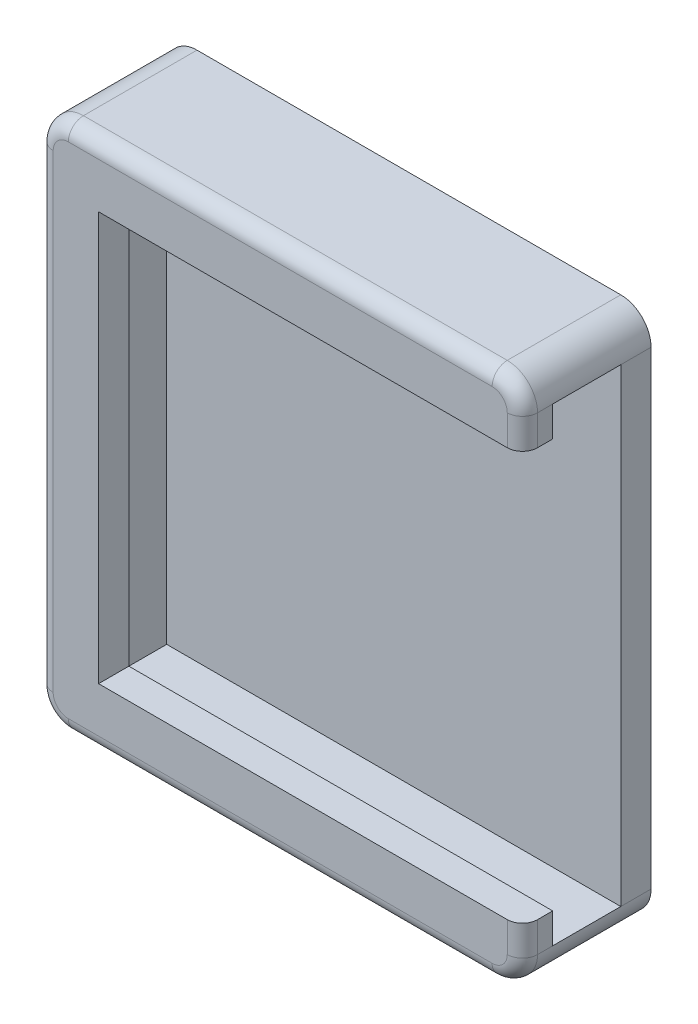
ISO-10303-21;
HEADER;
FILE_DESCRIPTION(('STEP AP214'),'2;1');
FILE_NAME('part.step','',(''),(''),'','','');
FILE_SCHEMA(('AUTOMOTIVE_DESIGN { 1 0 10303 214 1 1 1 1 }'));
ENDSEC;
DATA;
#1=APPLICATION_CONTEXT('core data for automotive mechanical design processes');
#2=APPLICATION_PROTOCOL_DEFINITION('international standard','automotive_design',2000,#1);
#3=PRODUCT_CONTEXT('',#1,'mechanical');
#4=PRODUCT('Part','Part','',(#3));
#5=PRODUCT_RELATED_PRODUCT_CATEGORY('part','',(#4));
#6=PRODUCT_DEFINITION_FORMATION('','',#4);
#7=PRODUCT_DEFINITION_CONTEXT('part definition',#1,'design');
#8=PRODUCT_DEFINITION('design','',#6,#7);
#9=PRODUCT_DEFINITION_SHAPE('','',#8);
#10=(LENGTH_UNIT() NAMED_UNIT(*) SI_UNIT(.MILLI.,.METRE.));
#11=(NAMED_UNIT(*) PLANE_ANGLE_UNIT() SI_UNIT($,.RADIAN.));
#12=(NAMED_UNIT(*) SI_UNIT($,.STERADIAN.) SOLID_ANGLE_UNIT());
#13=UNCERTAINTY_MEASURE_WITH_UNIT(LENGTH_MEASURE(1.E-05),#10,'distance_accuracy_value','');
#14=(GEOMETRIC_REPRESENTATION_CONTEXT(3) GLOBAL_UNCERTAINTY_ASSIGNED_CONTEXT((#13)) GLOBAL_UNIT_ASSIGNED_CONTEXT((#10,
#11,#12)) REPRESENTATION_CONTEXT('',''));
#15=CARTESIAN_POINT('',(0.,0.,0.));
#16=DIRECTION('',(0.,0.,1.));
#17=DIRECTION('',(1.,0.,0.));
#18=AXIS2_PLACEMENT_3D('',#15,#16,#17);
#19=CARTESIAN_POINT('',(-157.423957436964,7.33161186550156,2.));
#20=DIRECTION('',(-1.,0.,0.));
#21=DIRECTION('',(0.,0.,1.));
#22=AXIS2_PLACEMENT_3D('',#19,#20,#21);
#23=PLANE('',#22);
#24=DIRECTION('',(0.,1.,0.));
#25=VECTOR('',#24,1.);
#26=CARTESIAN_POINT('',(-157.423957436964,7.33161186550156,0.));
#27=LINE('',#26,#25);
#28=CARTESIAN_POINT('',(-157.423957436964,9.33161186550156,0.));
#29=VERTEX_POINT('',#28);
#30=CARTESIAN_POINT('',(-157.423957436964,40.3316118655016,0.));
#31=VERTEX_POINT('',#30);
#32=EDGE_CURVE('E265',#29,#31,#27,.T.);
#33=ORIENTED_EDGE('',*,*,#32,.T.);
#34=DIRECTION('',(0.,0.,-1.));
#35=VECTOR('',#34,1.);
#36=CARTESIAN_POINT('',(-157.423957436964,40.3316118655016,2.));
#37=LINE('',#36,#35);
#38=CARTESIAN_POINT('',(-157.423957436964,40.3316118655016,2.));
#39=VERTEX_POINT('',#38);
#40=EDGE_CURVE('E289',#31,#39,#37,.F.);
#41=ORIENTED_EDGE('',*,*,#40,.T.);
#42=DIRECTION('',(0.,1.,0.));
#43=VECTOR('',#42,1.);
#44=CARTESIAN_POINT('',(-157.423957436964,7.33161186550156,2.));
#45=LINE('',#44,#43);
#46=CARTESIAN_POINT('',(-157.423957436964,9.33161186550156,2.));
#47=VERTEX_POINT('',#46);
#48=EDGE_CURVE('E255',#47,#39,#45,.T.);
#49=ORIENTED_EDGE('',*,*,#48,.F.);
#50=DIRECTION('',(0.,0.,-1.));
#51=VECTOR('',#50,1.);
#52=CARTESIAN_POINT('',(-157.423957436964,9.33161186550156,2.));
#53=LINE('',#52,#51);
#54=EDGE_CURVE('E282',#47,#29,#53,.T.);
#55=ORIENTED_EDGE('',*,*,#54,.T.);
#56=EDGE_LOOP('',(#33,#41,#49,#55));
#57=FACE_BOUND('',#56,.T.);
#58=ADVANCED_FACE('F35',(#57),#23,.F.);
#59=DIRECTION('',(0.,0.,-1.));
#60=VECTOR('',#59,1.);
#61=CARTESIAN_POINT('',(-157.423957436964,11.3316118655016,8.5));
#62=LINE('',#61,#60);
#63=CARTESIAN_POINT('',(-157.423957436964,11.3316118655016,7.5));
#64=VERTEX_POINT('',#63);
#65=CARTESIAN_POINT('',(-157.423957436964,11.3316118655016,6.5));
#66=VERTEX_POINT('',#65);
#67=EDGE_CURVE('E199',#64,#66,#62,.T.);
#68=ORIENTED_EDGE('',*,*,#67,.F.);
#69=DIRECTION('',(0.,1.,0.));
#70=VECTOR('',#69,1.);
#71=CARTESIAN_POINT('',(-157.423957436964,7.33161186550156,7.5));
#72=LINE('',#71,#70);
#73=CARTESIAN_POINT('',(-157.423957436964,9.33161186550156,7.5));
#74=VERTEX_POINT('',#73);
#75=EDGE_CURVE('E329',#64,#74,#72,.F.);
#76=ORIENTED_EDGE('',*,*,#75,.T.);
#77=DIRECTION('',(0.,0.,-1.));
#78=VECTOR('',#77,1.);
#79=CARTESIAN_POINT('',(-157.423957436964,9.33161186550156,2.));
#80=LINE('',#79,#78);
#81=CARTESIAN_POINT('',(-157.423957436964,9.33161186550156,6.5));
#82=VERTEX_POINT('',#81);
#83=EDGE_CURVE('E284',#74,#82,#80,.T.);
#84=ORIENTED_EDGE('',*,*,#83,.T.);
#85=DIRECTION('',(0.,1.,0.));
#86=VECTOR('',#85,1.);
#87=CARTESIAN_POINT('',(-157.423957436964,7.33161186550156,6.5));
#88=LINE('',#87,#86);
#89=EDGE_CURVE('E213',#82,#66,#88,.T.);
#90=ORIENTED_EDGE('',*,*,#89,.T.);
#91=EDGE_LOOP('',(#68,#76,#84,#90));
#92=FACE_BOUND('',#91,.T.);
#93=ADVANCED_FACE('F366',(#92),#23,.F.);
#94=CARTESIAN_POINT('',(0.,0.,2.));
#95=DIRECTION('',(0.,0.,-1.));
#96=DIRECTION('',(-1.,0.,0.));
#97=AXIS2_PLACEMENT_3D('',#94,#95,#96);
#98=PLANE('',#97);
#99=DIRECTION('',(1.,0.,0.));
#100=VECTOR('',#99,1.);
#101=CARTESIAN_POINT('',(-157.423957436964,40.3316118655016,2.));
#102=LINE('',#101,#100);
#103=CARTESIAN_POINT('',(-187.423957436964,40.3316118655016,2.));
#104=VERTEX_POINT('',#103);
#105=EDGE_CURVE('E238',#104,#39,#102,.T.);
#106=ORIENTED_EDGE('',*,*,#105,.F.);
#107=DIRECTION('',(0.,1.,0.));
#108=VECTOR('',#107,1.);
#109=CARTESIAN_POINT('',(-187.423957436964,40.3316118655016,2.));
#110=LINE('',#109,#108);
#111=CARTESIAN_POINT('',(-187.423957436964,9.33161186550156,2.));
#112=VERTEX_POINT('',#111);
#113=EDGE_CURVE('E235',#112,#104,#110,.T.);
#114=ORIENTED_EDGE('',*,*,#113,.F.);
#115=DIRECTION('',(-1.,0.,0.));
#116=VECTOR('',#115,1.);
#117=CARTESIAN_POINT('',(-187.423957436964,9.33161186550156,2.));
#118=LINE('',#117,#116);
#119=EDGE_CURVE('E224',#47,#112,#118,.T.);
#120=ORIENTED_EDGE('',*,*,#119,.F.);
#121=ORIENTED_EDGE('',*,*,#48,.T.);
#122=EDGE_LOOP('',(#106,#114,#120,#121));
#123=FACE_BOUND('',#122,.T.);
#124=ADVANCED_FACE('F422',(#123),#98,.F.);
#125=CARTESIAN_POINT('',(-189.423957436964,7.33161186550156,2.));
#126=DIRECTION('',(1.,0.,0.));
#127=DIRECTION('',(0.,0.,-1.));
#128=AXIS2_PLACEMENT_3D('',#125,#126,#127);
#129=PLANE('',#128);
#130=DIRECTION('',(0.,0.,-1.));
#131=VECTOR('',#130,1.);
#132=CARTESIAN_POINT('',(-189.423957436964,9.33161186550156,2.));
#133=LINE('',#132,#131);
#134=CARTESIAN_POINT('',(-189.423957436964,9.33161186550156,0.));
#135=VERTEX_POINT('',#134);
#136=CARTESIAN_POINT('',(-189.423957436964,9.33161186550156,7.5));
#137=VERTEX_POINT('',#136);
#138=EDGE_CURVE('E295',#135,#137,#133,.F.);
#139=ORIENTED_EDGE('',*,*,#138,.T.);
#140=DIRECTION('',(0.,-1.,0.));
#141=VECTOR('',#140,1.);
#142=CARTESIAN_POINT('',(-189.423957436964,7.33161186550156,7.5));
#143=LINE('',#142,#141);
#144=CARTESIAN_POINT('',(-189.423957436964,40.3316118655016,7.5));
#145=VERTEX_POINT('',#144);
#146=EDGE_CURVE('E11',#137,#145,#143,.F.);
#147=ORIENTED_EDGE('',*,*,#146,.T.);
#148=DIRECTION('',(0.,0.,-1.));
#149=VECTOR('',#148,1.);
#150=CARTESIAN_POINT('',(-189.423957436964,40.3316118655016,2.));
#151=LINE('',#150,#149);
#152=CARTESIAN_POINT('',(-189.423957436964,40.3316118655016,0.));
#153=VERTEX_POINT('',#152);
#154=EDGE_CURVE('E297',#145,#153,#151,.T.);
#155=ORIENTED_EDGE('',*,*,#154,.T.);
#156=DIRECTION('',(0.,-1.,0.));
#157=VECTOR('',#156,1.);
#158=CARTESIAN_POINT('',(-189.423957436964,7.33161186550156,0.));
#159=LINE('',#158,#157);
#160=EDGE_CURVE('E232',#153,#135,#159,.T.);
#161=ORIENTED_EDGE('',*,*,#160,.T.);
#162=EDGE_LOOP('',(#139,#147,#155,#161));
#163=FACE_BOUND('',#162,.T.);
#164=ADVANCED_FACE('F435',(#163),#129,.F.);
#165=CARTESIAN_POINT('',(-189.423957436964,7.33161186550156,2.));
#166=DIRECTION('',(0.,1.,0.));
#167=DIRECTION('',(0.,0.,1.));
#168=AXIS2_PLACEMENT_3D('',#165,#166,#167);
#169=PLANE('',#168);
#170=DIRECTION('',(0.,0.,-1.));
#171=VECTOR('',#170,1.);
#172=CARTESIAN_POINT('',(-159.423957436964,7.33161186550156,2.));
#173=LINE('',#172,#171);
#174=CARTESIAN_POINT('',(-159.423957436964,7.33161186550156,0.));
#175=VERTEX_POINT('',#174);
#176=CARTESIAN_POINT('',(-159.423957436964,7.33161186550156,7.5));
#177=VERTEX_POINT('',#176);
#178=EDGE_CURVE('E293',#175,#177,#173,.F.);
#179=ORIENTED_EDGE('',*,*,#178,.T.);
#180=DIRECTION('',(1.,0.,0.));
#181=VECTOR('',#180,1.);
#182=CARTESIAN_POINT('',(-189.423957436964,7.33161186550156,7.5));
#183=LINE('',#182,#181);
#184=CARTESIAN_POINT('',(-187.423957436964,7.33161186550156,7.5));
#185=VERTEX_POINT('',#184);
#186=EDGE_CURVE('E59',#177,#185,#183,.F.);
#187=ORIENTED_EDGE('',*,*,#186,.T.);
#188=DIRECTION('',(0.,0.,-1.));
#189=VECTOR('',#188,1.);
#190=CARTESIAN_POINT('',(-187.423957436964,7.33161186550156,2.));
#191=LINE('',#190,#189);
#192=CARTESIAN_POINT('',(-187.423957436964,7.33161186550156,0.));
#193=VERTEX_POINT('',#192);
#194=EDGE_CURVE('E291',#185,#193,#191,.T.);
#195=ORIENTED_EDGE('',*,*,#194,.T.);
#196=DIRECTION('',(1.,0.,0.));
#197=VECTOR('',#196,1.);
#198=CARTESIAN_POINT('',(-189.423957436964,7.33161186550156,0.));
#199=LINE('',#198,#197);
#200=EDGE_CURVE('E262',#193,#175,#199,.T.);
#201=ORIENTED_EDGE('',*,*,#200,.T.);
#202=EDGE_LOOP('',(#179,#187,#195,#201));
#203=FACE_BOUND('',#202,.T.);
#204=ADVANCED_FACE('F427',(#203),#169,.F.);
#205=DIRECTION('',(0.,0.,-1.));
#206=VECTOR('',#205,1.);
#207=CARTESIAN_POINT('',(-157.423957436964,40.3316118655016,2.));
#208=LINE('',#207,#206);
#209=CARTESIAN_POINT('',(-157.423957436964,40.3316118655016,6.5));
#210=VERTEX_POINT('',#209);
#211=CARTESIAN_POINT('',(-157.423957436964,40.3316118655016,7.5));
#212=VERTEX_POINT('',#211);
#213=EDGE_CURVE('E286',#210,#212,#208,.F.);
#214=ORIENTED_EDGE('',*,*,#213,.T.);
#215=DIRECTION('',(0.,1.,0.));
#216=VECTOR('',#215,1.);
#217=CARTESIAN_POINT('',(-157.423957436964,7.33161186550156,7.5));
#218=LINE('',#217,#216);
#219=CARTESIAN_POINT('',(-157.423957436964,38.3316118655016,7.5));
#220=VERTEX_POINT('',#219);
#221=EDGE_CURVE('E317',#212,#220,#218,.F.);
#222=ORIENTED_EDGE('',*,*,#221,.T.);
#223=DIRECTION('',(0.,0.,-1.));
#224=VECTOR('',#223,1.);
#225=CARTESIAN_POINT('',(-157.423957436964,38.3316118655016,8.5));
#226=LINE('',#225,#224);
#227=CARTESIAN_POINT('',(-157.423957436964,38.3316118655016,6.5));
#228=VERTEX_POINT('',#227);
#229=EDGE_CURVE('E207',#220,#228,#226,.T.);
#230=ORIENTED_EDGE('',*,*,#229,.T.);
#231=DIRECTION('',(0.,1.,0.));
#232=VECTOR('',#231,1.);
#233=CARTESIAN_POINT('',(-157.423957436964,42.3316118655016,6.5));
#234=LINE('',#233,#232);
#235=EDGE_CURVE('E210',#228,#210,#234,.T.);
#236=ORIENTED_EDGE('',*,*,#235,.T.);
#237=EDGE_LOOP('',(#214,#222,#230,#236));
#238=FACE_BOUND('',#237,.T.);
#239=ADVANCED_FACE('F418',(#238),#23,.F.);
#240=CARTESIAN_POINT('',(-189.423957436964,42.3316118655016,2.));
#241=DIRECTION('',(0.,-1.,0.));
#242=DIRECTION('',(0.,0.,-1.));
#243=AXIS2_PLACEMENT_3D('',#240,#241,#242);
#244=PLANE('',#243);
#245=DIRECTION('',(0.,0.,-1.));
#246=VECTOR('',#245,1.);
#247=CARTESIAN_POINT('',(-187.423957436964,42.3316118655016,2.));
#248=LINE('',#247,#246);
#249=CARTESIAN_POINT('',(-187.423957436964,42.3316118655016,0.));
#250=VERTEX_POINT('',#249);
#251=CARTESIAN_POINT('',(-187.423957436964,42.3316118655016,7.5));
#252=VERTEX_POINT('',#251);
#253=EDGE_CURVE('E258',#250,#252,#248,.F.);
#254=ORIENTED_EDGE('',*,*,#253,.T.);
#255=DIRECTION('',(-1.,0.,0.));
#256=VECTOR('',#255,1.);
#257=CARTESIAN_POINT('',(-189.423957436964,42.3316118655016,7.5));
#258=LINE('',#257,#256);
#259=CARTESIAN_POINT('',(-159.423957436964,42.3316118655016,7.5));
#260=VERTEX_POINT('',#259);
#261=EDGE_CURVE('E323',#252,#260,#258,.F.);
#262=ORIENTED_EDGE('',*,*,#261,.T.);
#263=DIRECTION('',(0.,0.,-1.));
#264=VECTOR('',#263,1.);
#265=CARTESIAN_POINT('',(-159.423957436964,42.3316118655016,2.));
#266=LINE('',#265,#264);
#267=CARTESIAN_POINT('',(-159.423957436964,42.3316118655016,0.));
#268=VERTEX_POINT('',#267);
#269=EDGE_CURVE('E272',#260,#268,#266,.T.);
#270=ORIENTED_EDGE('',*,*,#269,.T.);
#271=DIRECTION('',(-1.,0.,0.));
#272=VECTOR('',#271,1.);
#273=CARTESIAN_POINT('',(-189.423957436964,42.3316118655016,0.));
#274=LINE('',#273,#272);
#275=EDGE_CURVE('E259',#268,#250,#274,.T.);
#276=ORIENTED_EDGE('',*,*,#275,.T.);
#277=EDGE_LOOP('',(#254,#262,#270,#276));
#278=FACE_BOUND('',#277,.T.);
#279=ADVANCED_FACE('F426',(#278),#244,.F.);
#280=CARTESIAN_POINT('',(0.,0.,0.));
#281=DIRECTION('',(0.,0.,-1.));
#282=DIRECTION('',(-1.,0.,0.));
#283=AXIS2_PLACEMENT_3D('',#280,#281,#282);
#284=PLANE('',#283);
#285=ORIENTED_EDGE('',*,*,#275,.F.);
#286=CARTESIAN_POINT('',(-159.423957436964,40.3316118655016,0.));
#287=DIRECTION('',(0.,0.,-1.));
#288=DIRECTION('',(-1.,0.,0.));
#289=AXIS2_PLACEMENT_3D('',#286,#287,#288);
#290=CIRCLE('',#289,2.);
#291=EDGE_CURVE('E280',#268,#31,#290,.T.);
#292=ORIENTED_EDGE('',*,*,#291,.T.);
#293=ORIENTED_EDGE('',*,*,#32,.F.);
#294=CARTESIAN_POINT('',(-159.423957436964,9.33161186550156,0.));
#295=DIRECTION('',(0.,0.,-1.));
#296=DIRECTION('',(-1.,0.,0.));
#297=AXIS2_PLACEMENT_3D('',#294,#295,#296);
#298=CIRCLE('',#297,2.);
#299=EDGE_CURVE('E278',#29,#175,#298,.T.);
#300=ORIENTED_EDGE('',*,*,#299,.T.);
#301=ORIENTED_EDGE('',*,*,#200,.F.);
#302=CARTESIAN_POINT('',(-187.423957436964,9.33161186550156,0.));
#303=DIRECTION('',(0.,0.,-1.));
#304=DIRECTION('',(-1.,0.,0.));
#305=AXIS2_PLACEMENT_3D('',#302,#303,#304);
#306=CIRCLE('',#305,2.);
#307=EDGE_CURVE('E274',#193,#135,#306,.T.);
#308=ORIENTED_EDGE('',*,*,#307,.T.);
#309=ORIENTED_EDGE('',*,*,#160,.F.);
#310=CARTESIAN_POINT('',(-187.423957436964,40.3316118655016,0.));
#311=DIRECTION('',(0.,0.,-1.));
#312=DIRECTION('',(-1.,0.,0.));
#313=AXIS2_PLACEMENT_3D('',#310,#311,#312);
#314=CIRCLE('',#313,2.);
#315=EDGE_CURVE('E276',#153,#250,#314,.T.);
#316=ORIENTED_EDGE('',*,*,#315,.T.);
#317=EDGE_LOOP('',(#285,#292,#293,#300,#301,#308,#309,#316));
#318=FACE_BOUND('',#317,.T.);
#319=ADVANCED_FACE('F433',(#318),#284,.T.);
#320=CARTESIAN_POINT('',(-157.423957436964,40.3316118655016,53.9236228055175));
#321=DIRECTION('',(0.,1.,0.));
#322=DIRECTION('',(0.,0.,1.));
#323=AXIS2_PLACEMENT_3D('',#320,#321,#322);
#324=PLANE('',#323);
#325=DIRECTION('',(0.,0.,-1.));
#326=VECTOR('',#325,1.);
#327=CARTESIAN_POINT('',(-157.423957436964,40.3316118655016,53.9236228055175));
#328=LINE('',#327,#326);
#329=EDGE_CURVE('E241',#210,#39,#328,.T.);
#330=ORIENTED_EDGE('',*,*,#329,.F.);
#331=DIRECTION('',(-1.,0.,0.));
#332=VECTOR('',#331,1.);
#333=CARTESIAN_POINT('',(-157.423957436964,40.3316118655016,6.50000000000001));
#334=LINE('',#333,#332);
#335=CARTESIAN_POINT('',(-187.423957436964,40.3316118655016,6.50000000000001));
#336=VERTEX_POINT('',#335);
#337=EDGE_CURVE('E229',#210,#336,#334,.T.);
#338=ORIENTED_EDGE('',*,*,#337,.T.);
#339=DIRECTION('',(0.,0.,-1.));
#340=VECTOR('',#339,1.);
#341=CARTESIAN_POINT('',(-187.423957436964,40.3316118655016,53.9236228055175));
#342=LINE('',#341,#340);
#343=EDGE_CURVE('E244',#336,#104,#342,.T.);
#344=ORIENTED_EDGE('',*,*,#343,.T.);
#345=ORIENTED_EDGE('',*,*,#105,.T.);
#346=EDGE_LOOP('',(#330,#338,#344,#345));
#347=FACE_BOUND('',#346,.T.);
#348=ADVANCED_FACE('F468',(#347),#324,.F.);
#349=CARTESIAN_POINT('',(-187.423957436964,40.3316118655016,53.9236228055175));
#350=DIRECTION('',(-1.,0.,0.));
#351=DIRECTION('',(0.,0.,1.));
#352=AXIS2_PLACEMENT_3D('',#349,#350,#351);
#353=PLANE('',#352);
#354=ORIENTED_EDGE('',*,*,#343,.F.);
#355=DIRECTION('',(0.,-1.,0.));
#356=VECTOR('',#355,1.);
#357=CARTESIAN_POINT('',(-187.423957436964,40.3316118655016,6.50000000000001));
#358=LINE('',#357,#356);
#359=CARTESIAN_POINT('',(-187.423957436964,9.33161186550156,6.50000000000001));
#360=VERTEX_POINT('',#359);
#361=EDGE_CURVE('E225',#336,#360,#358,.T.);
#362=ORIENTED_EDGE('',*,*,#361,.T.);
#363=DIRECTION('',(0.,0.,-1.));
#364=VECTOR('',#363,1.);
#365=CARTESIAN_POINT('',(-187.423957436964,9.33161186550156,53.9236228055175));
#366=LINE('',#365,#364);
#367=EDGE_CURVE('E247',#360,#112,#366,.T.);
#368=ORIENTED_EDGE('',*,*,#367,.T.);
#369=ORIENTED_EDGE('',*,*,#113,.T.);
#370=EDGE_LOOP('',(#354,#362,#368,#369));
#371=FACE_BOUND('',#370,.T.);
#372=ADVANCED_FACE('F466',(#371),#353,.F.);
#373=CARTESIAN_POINT('',(-187.423957436964,9.33161186550156,53.9236228055175));
#374=DIRECTION('',(0.,-1.,0.));
#375=DIRECTION('',(0.,0.,-1.));
#376=AXIS2_PLACEMENT_3D('',#373,#374,#375);
#377=PLANE('',#376);
#378=ORIENTED_EDGE('',*,*,#367,.F.);
#379=DIRECTION('',(1.,0.,0.));
#380=VECTOR('',#379,1.);
#381=CARTESIAN_POINT('',(-187.423957436964,9.33161186550156,6.50000000000001));
#382=LINE('',#381,#380);
#383=EDGE_CURVE('E228',#360,#82,#382,.T.);
#384=ORIENTED_EDGE('',*,*,#383,.T.);
#385=DIRECTION('',(0.,0.,-1.));
#386=VECTOR('',#385,1.);
#387=CARTESIAN_POINT('',(-157.423957436964,9.33161186550156,53.9236228055175));
#388=LINE('',#387,#386);
#389=EDGE_CURVE('E250',#82,#47,#388,.T.);
#390=ORIENTED_EDGE('',*,*,#389,.T.);
#391=ORIENTED_EDGE('',*,*,#119,.T.);
#392=EDGE_LOOP('',(#378,#384,#390,#391));
#393=FACE_BOUND('',#392,.T.);
#394=ADVANCED_FACE('F463',(#393),#377,.F.);
#395=CARTESIAN_POINT('',(0.,0.,6.5));
#396=DIRECTION('',(0.,0.,-1.));
#397=DIRECTION('',(-1.,0.,0.));
#398=AXIS2_PLACEMENT_3D('',#395,#396,#397);
#399=PLANE('',#398);
#400=ORIENTED_EDGE('',*,*,#383,.F.);
#401=ORIENTED_EDGE('',*,*,#361,.F.);
#402=ORIENTED_EDGE('',*,*,#337,.F.);
#403=ORIENTED_EDGE('',*,*,#235,.F.);
#404=DIRECTION('',(1.,0.,0.));
#405=VECTOR('',#404,1.);
#406=CARTESIAN_POINT('',(-157.423957436964,38.3316118655016,6.5));
#407=LINE('',#406,#405);
#408=CARTESIAN_POINT('',(-185.423957436964,38.3316118655016,6.5));
#409=VERTEX_POINT('',#408);
#410=EDGE_CURVE('E190',#409,#228,#407,.T.);
#411=ORIENTED_EDGE('',*,*,#410,.F.);
#412=DIRECTION('',(0.,1.,0.));
#413=VECTOR('',#412,1.);
#414=CARTESIAN_POINT('',(-185.423957436964,38.3316118655016,6.5));
#415=LINE('',#414,#413);
#416=CARTESIAN_POINT('',(-185.423957436964,11.3316118655016,6.5));
#417=VERTEX_POINT('',#416);
#418=EDGE_CURVE('E217',#417,#409,#415,.T.);
#419=ORIENTED_EDGE('',*,*,#418,.F.);
#420=DIRECTION('',(-1.,0.,0.));
#421=VECTOR('',#420,1.);
#422=CARTESIAN_POINT('',(-185.423957436964,11.3316118655016,6.5));
#423=LINE('',#422,#421);
#424=EDGE_CURVE('E196',#66,#417,#423,.T.);
#425=ORIENTED_EDGE('',*,*,#424,.F.);
#426=ORIENTED_EDGE('',*,*,#89,.F.);
#427=EDGE_LOOP('',(#400,#401,#402,#403,#411,#419,#425,#426));
#428=FACE_BOUND('',#427,.T.);
#429=ADVANCED_FACE('F371',(#428),#399,.T.);
#430=CARTESIAN_POINT('',(-185.423957436964,11.3316118655016,8.5));
#431=DIRECTION('',(0.,-1.,0.));
#432=DIRECTION('',(0.,0.,-1.));
#433=AXIS2_PLACEMENT_3D('',#430,#431,#432);
#434=PLANE('',#433);
#435=DIRECTION('',(-1.,0.,0.));
#436=VECTOR('',#435,1.);
#437=CARTESIAN_POINT('',(-185.423957436964,11.3316118655016,8.5));
#438=LINE('',#437,#436);
#439=CARTESIAN_POINT('',(-158.423957436964,11.3316118655016,8.5));
#440=VERTEX_POINT('',#439);
#441=CARTESIAN_POINT('',(-185.423957436964,11.3316118655016,8.5));
#442=VERTEX_POINT('',#441);
#443=EDGE_CURVE('E179',#440,#442,#438,.T.);
#444=ORIENTED_EDGE('',*,*,#443,.F.);
#445=CARTESIAN_POINT('',(-158.423957436964,11.3316118655016,7.5));
#446=DIRECTION('',(0.,-1.,0.));
#447=DIRECTION('',(0.,0.,-1.));
#448=AXIS2_PLACEMENT_3D('',#445,#446,#447);
#449=CIRCLE('',#448,1.);
#450=EDGE_CURVE('E327',#440,#64,#449,.F.);
#451=ORIENTED_EDGE('',*,*,#450,.T.);
#452=ORIENTED_EDGE('',*,*,#67,.T.);
#453=ORIENTED_EDGE('',*,*,#424,.T.);
#454=DIRECTION('',(0.,0.,-1.));
#455=VECTOR('',#454,1.);
#456=CARTESIAN_POINT('',(-185.423957436964,11.3316118655016,8.5));
#457=LINE('',#456,#455);
#458=EDGE_CURVE('E193',#442,#417,#457,.T.);
#459=ORIENTED_EDGE('',*,*,#458,.F.);
#460=EDGE_LOOP('',(#444,#451,#452,#453,#459));
#461=FACE_BOUND('',#460,.T.);
#462=ADVANCED_FACE('F194',(#461),#434,.F.);
#463=CARTESIAN_POINT('',(-185.423957436964,38.3316118655016,8.5));
#464=DIRECTION('',(-1.,0.,0.));
#465=DIRECTION('',(0.,0.,1.));
#466=AXIS2_PLACEMENT_3D('',#463,#464,#465);
#467=PLANE('',#466);
#468=ORIENTED_EDGE('',*,*,#418,.T.);
#469=DIRECTION('',(0.,0.,-1.));
#470=VECTOR('',#469,1.);
#471=CARTESIAN_POINT('',(-185.423957436964,38.3316118655016,8.5));
#472=LINE('',#471,#470);
#473=CARTESIAN_POINT('',(-185.423957436964,38.3316118655016,8.5));
#474=VERTEX_POINT('',#473);
#475=EDGE_CURVE('E200',#474,#409,#472,.T.);
#476=ORIENTED_EDGE('',*,*,#475,.F.);
#477=DIRECTION('',(0.,1.,0.));
#478=VECTOR('',#477,1.);
#479=CARTESIAN_POINT('',(-185.423957436964,38.3316118655016,8.5));
#480=LINE('',#479,#478);
#481=EDGE_CURVE('E184',#442,#474,#480,.T.);
#482=ORIENTED_EDGE('',*,*,#481,.F.);
#483=ORIENTED_EDGE('',*,*,#458,.T.);
#484=EDGE_LOOP('',(#468,#476,#482,#483));
#485=FACE_BOUND('',#484,.T.);
#486=ADVANCED_FACE('F202',(#485),#467,.F.);
#487=CARTESIAN_POINT('',(-157.423957436964,38.3316118655016,8.5));
#488=DIRECTION('',(0.,1.,0.));
#489=DIRECTION('',(-1.,0.,0.));
#490=AXIS2_PLACEMENT_3D('',#487,#488,#489);
#491=PLANE('',#490);
#492=ORIENTED_EDGE('',*,*,#229,.F.);
#493=CARTESIAN_POINT('',(-158.423957436964,38.3316118655016,7.5));
#494=DIRECTION('',(0.,1.,0.));
#495=DIRECTION('',(-1.,0.,0.));
#496=AXIS2_PLACEMENT_3D('',#493,#494,#495);
#497=CIRCLE('',#496,1.);
#498=CARTESIAN_POINT('',(-158.423957436964,38.3316118655016,8.5));
#499=VERTEX_POINT('',#498);
#500=EDGE_CURVE('E319',#220,#499,#497,.F.);
#501=ORIENTED_EDGE('',*,*,#500,.T.);
#502=DIRECTION('',(1.,0.,0.));
#503=VECTOR('',#502,1.);
#504=CARTESIAN_POINT('',(-157.423957436964,38.3316118655016,8.5));
#505=LINE('',#504,#503);
#506=EDGE_CURVE('E205',#474,#499,#505,.T.);
#507=ORIENTED_EDGE('',*,*,#506,.F.);
#508=ORIENTED_EDGE('',*,*,#475,.T.);
#509=ORIENTED_EDGE('',*,*,#410,.T.);
#510=EDGE_LOOP('',(#492,#501,#507,#508,#509));
#511=FACE_BOUND('',#510,.T.);
#512=ADVANCED_FACE('F376',(#511),#491,.F.);
#513=CARTESIAN_POINT('',(0.,0.,8.5));
#514=DIRECTION('',(0.,0.,-1.));
#515=DIRECTION('',(-1.,0.,0.));
#516=AXIS2_PLACEMENT_3D('',#513,#514,#515);
#517=PLANE('',#516);
#518=ORIENTED_EDGE('',*,*,#506,.T.);
#519=DIRECTION('',(0.,1.,0.));
#520=VECTOR('',#519,1.);
#521=CARTESIAN_POINT('',(-158.423957436964,0.,8.5));
#522=LINE('',#521,#520);
#523=CARTESIAN_POINT('',(-158.423957436964,40.3316118655016,8.5));
#524=VERTEX_POINT('',#523);
#525=EDGE_CURVE('E314',#499,#524,#522,.T.);
#526=ORIENTED_EDGE('',*,*,#525,.T.);
#527=CARTESIAN_POINT('',(-159.423957436964,40.3316118655016,8.5));
#528=DIRECTION('',(0.,0.,-1.));
#529=DIRECTION('',(-1.,0.,0.));
#530=AXIS2_PLACEMENT_3D('',#527,#528,#529);
#531=CIRCLE('',#530,1.);
#532=CARTESIAN_POINT('',(-159.423957436964,41.3316118655016,8.5));
#533=VERTEX_POINT('',#532);
#534=EDGE_CURVE('E312',#524,#533,#531,.F.);
#535=ORIENTED_EDGE('',*,*,#534,.T.);
#536=DIRECTION('',(-1.,0.,0.));
#537=VECTOR('',#536,1.);
#538=CARTESIAN_POINT('',(0.,41.3316118655016,8.5));
#539=LINE('',#538,#537);
#540=CARTESIAN_POINT('',(-187.423957436964,41.3316118655016,8.5));
#541=VERTEX_POINT('',#540);
#542=EDGE_CURVE('E310',#533,#541,#539,.T.);
#543=ORIENTED_EDGE('',*,*,#542,.T.);
#544=CARTESIAN_POINT('',(-187.423957436964,40.3316118655016,8.5));
#545=DIRECTION('',(0.,0.,-1.));
#546=DIRECTION('',(-1.,0.,0.));
#547=AXIS2_PLACEMENT_3D('',#544,#545,#546);
#548=CIRCLE('',#547,1.);
#549=CARTESIAN_POINT('',(-188.423957436964,40.3316118655016,8.5));
#550=VERTEX_POINT('',#549);
#551=EDGE_CURVE('E308',#541,#550,#548,.F.);
#552=ORIENTED_EDGE('',*,*,#551,.T.);
#553=DIRECTION('',(0.,-1.,0.));
#554=VECTOR('',#553,1.);
#555=CARTESIAN_POINT('',(-188.423957436964,0.,8.5));
#556=LINE('',#555,#554);
#557=CARTESIAN_POINT('',(-188.423957436964,9.33161186550156,8.5));
#558=VERTEX_POINT('',#557);
#559=EDGE_CURVE('E299',#550,#558,#556,.T.);
#560=ORIENTED_EDGE('',*,*,#559,.T.);
#561=CARTESIAN_POINT('',(-187.423957436964,9.33161186550156,8.5));
#562=DIRECTION('',(0.,0.,-1.));
#563=DIRECTION('',(-1.,0.,0.));
#564=AXIS2_PLACEMENT_3D('',#561,#562,#563);
#565=CIRCLE('',#564,1.);
#566=CARTESIAN_POINT('',(-187.423957436964,8.33161186550156,8.5));
#567=VERTEX_POINT('',#566);
#568=EDGE_CURVE('E301',#558,#567,#565,.F.);
#569=ORIENTED_EDGE('',*,*,#568,.T.);
#570=DIRECTION('',(1.,0.,0.));
#571=VECTOR('',#570,1.);
#572=CARTESIAN_POINT('',(0.,8.33161186550156,8.5));
#573=LINE('',#572,#571);
#574=CARTESIAN_POINT('',(-159.423957436964,8.33161186550156,8.5));
#575=VERTEX_POINT('',#574);
#576=EDGE_CURVE('E303',#567,#575,#573,.T.);
#577=ORIENTED_EDGE('',*,*,#576,.T.);
#578=CARTESIAN_POINT('',(-159.423957436964,9.33161186550156,8.5));
#579=DIRECTION('',(0.,0.,-1.));
#580=DIRECTION('',(-1.,0.,0.));
#581=AXIS2_PLACEMENT_3D('',#578,#579,#580);
#582=CIRCLE('',#581,1.);
#583=CARTESIAN_POINT('',(-158.423957436964,9.33161186550156,8.5));
#584=VERTEX_POINT('',#583);
#585=EDGE_CURVE('E305',#575,#584,#582,.F.);
#586=ORIENTED_EDGE('',*,*,#585,.T.);
#587=DIRECTION('',(0.,1.,0.));
#588=VECTOR('',#587,1.);
#589=CARTESIAN_POINT('',(-158.423957436964,0.,8.5));
#590=LINE('',#589,#588);
#591=EDGE_CURVE('E187',#584,#440,#590,.T.);
#592=ORIENTED_EDGE('',*,*,#591,.T.);
#593=ORIENTED_EDGE('',*,*,#443,.T.);
#594=ORIENTED_EDGE('',*,*,#481,.T.);
#595=EDGE_LOOP('',(#518,#526,#535,#543,#552,#560,#569,#577,#586,#592,#593,#594));
#596=FACE_BOUND('',#595,.T.);
#597=ADVANCED_FACE('F182',(#596),#517,.F.);
#598=CARTESIAN_POINT('',(-159.423957436964,40.3316118655016,2.));
#599=DIRECTION('',(0.,0.,-1.));
#600=DIRECTION('',(-1.,0.,0.));
#601=AXIS2_PLACEMENT_3D('',#598,#599,#600);
#602=CYLINDRICAL_SURFACE('',#601,2.);
#603=ORIENTED_EDGE('',*,*,#269,.F.);
#604=CARTESIAN_POINT('',(-159.423957436964,40.3316118655016,7.5));
#605=DIRECTION('',(0.,0.,-1.));
#606=DIRECTION('',(-1.,0.,0.));
#607=AXIS2_PLACEMENT_3D('',#604,#605,#606);
#608=CIRCLE('',#607,2.);
#609=EDGE_CURVE('E321',#260,#212,#608,.T.);
#610=ORIENTED_EDGE('',*,*,#609,.T.);
#611=ORIENTED_EDGE('',*,*,#213,.F.);
#612=ORIENTED_EDGE('',*,*,#329,.T.);
#613=ORIENTED_EDGE('',*,*,#40,.F.);
#614=ORIENTED_EDGE('',*,*,#291,.F.);
#615=EDGE_LOOP('',(#603,#610,#611,#612,#613,#614));
#616=FACE_BOUND('',#615,.T.);
#617=ADVANCED_FACE('F440',(#616),#602,.T.);
#618=CARTESIAN_POINT('',(-159.423957436964,9.33161186550156,2.));
#619=DIRECTION('',(0.,0.,-1.));
#620=DIRECTION('',(-1.,0.,0.));
#621=AXIS2_PLACEMENT_3D('',#618,#619,#620);
#622=CYLINDRICAL_SURFACE('',#621,2.);
#623=ORIENTED_EDGE('',*,*,#83,.F.);
#624=CARTESIAN_POINT('',(-159.423957436964,9.33161186550156,7.5));
#625=DIRECTION('',(0.,0.,-1.));
#626=DIRECTION('',(-1.,0.,0.));
#627=AXIS2_PLACEMENT_3D('',#624,#625,#626);
#628=CIRCLE('',#627,2.);
#629=EDGE_CURVE('E331',#74,#177,#628,.T.);
#630=ORIENTED_EDGE('',*,*,#629,.T.);
#631=ORIENTED_EDGE('',*,*,#178,.F.);
#632=ORIENTED_EDGE('',*,*,#299,.F.);
#633=ORIENTED_EDGE('',*,*,#54,.F.);
#634=ORIENTED_EDGE('',*,*,#389,.F.);
#635=EDGE_LOOP('',(#623,#630,#631,#632,#633,#634));
#636=FACE_BOUND('',#635,.T.);
#637=ADVANCED_FACE('F459',(#636),#622,.T.);
#638=CARTESIAN_POINT('',(-187.423957436964,40.3316118655016,2.));
#639=DIRECTION('',(0.,0.,-1.));
#640=DIRECTION('',(-1.,0.,0.));
#641=AXIS2_PLACEMENT_3D('',#638,#639,#640);
#642=CYLINDRICAL_SURFACE('',#641,2.);
#643=ORIENTED_EDGE('',*,*,#154,.F.);
#644=CARTESIAN_POINT('',(-187.423957436964,40.3316118655016,7.5));
#645=DIRECTION('',(0.,0.,-1.));
#646=DIRECTION('',(-1.,0.,0.));
#647=AXIS2_PLACEMENT_3D('',#644,#645,#646);
#648=CIRCLE('',#647,2.);
#649=EDGE_CURVE('E325',#145,#252,#648,.T.);
#650=ORIENTED_EDGE('',*,*,#649,.T.);
#651=ORIENTED_EDGE('',*,*,#253,.F.);
#652=ORIENTED_EDGE('',*,*,#315,.F.);
#653=EDGE_LOOP('',(#643,#650,#651,#652));
#654=FACE_BOUND('',#653,.T.);
#655=ADVANCED_FACE('F448',(#654),#642,.T.);
#656=CARTESIAN_POINT('',(-187.423957436964,9.33161186550156,2.));
#657=DIRECTION('',(0.,0.,-1.));
#658=DIRECTION('',(-1.,0.,0.));
#659=AXIS2_PLACEMENT_3D('',#656,#657,#658);
#660=CYLINDRICAL_SURFACE('',#659,2.);
#661=ORIENTED_EDGE('',*,*,#194,.F.);
#662=CARTESIAN_POINT('',(-187.423957436964,9.33161186550156,7.5));
#663=DIRECTION('',(0.,0.,-1.));
#664=DIRECTION('',(-1.,0.,0.));
#665=AXIS2_PLACEMENT_3D('',#662,#663,#664);
#666=CIRCLE('',#665,2.);
#667=EDGE_CURVE('E44',#185,#137,#666,.T.);
#668=ORIENTED_EDGE('',*,*,#667,.T.);
#669=ORIENTED_EDGE('',*,*,#138,.F.);
#670=ORIENTED_EDGE('',*,*,#307,.F.);
#671=EDGE_LOOP('',(#661,#668,#669,#670));
#672=FACE_BOUND('',#671,.T.);
#673=ADVANCED_FACE('F452',(#672),#660,.T.);
#674=CARTESIAN_POINT('',(-158.423957436964,0.,7.5));
#675=DIRECTION('',(0.,1.,0.));
#676=DIRECTION('',(0.,0.,1.));
#677=AXIS2_PLACEMENT_3D('',#674,#675,#676);
#678=CYLINDRICAL_SURFACE('',#677,1.);
#679=ORIENTED_EDGE('',*,*,#450,.F.);
#680=ORIENTED_EDGE('',*,*,#591,.F.);
#681=CARTESIAN_POINT('',(-158.423957436964,9.33161186550156,7.5));
#682=DIRECTION('',(0.,-1.,0.));
#683=DIRECTION('',(0.,0.,-1.));
#684=AXIS2_PLACEMENT_3D('',#681,#682,#683);
#685=CIRCLE('',#684,1.);
#686=EDGE_CURVE('E39',#74,#584,#685,.T.);
#687=ORIENTED_EDGE('',*,*,#686,.F.);
#688=ORIENTED_EDGE('',*,*,#75,.F.);
#689=EDGE_LOOP('',(#679,#680,#687,#688));
#690=FACE_BOUND('',#689,.T.);
#691=ADVANCED_FACE('F37',(#690),#678,.T.);
#692=CARTESIAN_POINT('',(-159.423957436964,9.33161186550156,7.5));
#693=DIRECTION('',(0.,0.,-1.));
#694=DIRECTION('',(-1.,0.,0.));
#695=AXIS2_PLACEMENT_3D('',#692,#693,#694);
#696=DEGENERATE_TOROIDAL_SURFACE('',#695,1.,1.,.T.);
#697=ORIENTED_EDGE('',*,*,#686,.T.);
#698=ORIENTED_EDGE('',*,*,#585,.F.);
#699=CARTESIAN_POINT('',(-159.423957436964,8.33161186550156,7.5));
#700=DIRECTION('',(-1.,0.,0.));
#701=DIRECTION('',(0.,0.,1.));
#702=AXIS2_PLACEMENT_3D('',#699,#700,#701);
#703=CIRCLE('',#702,1.);
#704=EDGE_CURVE('E351',#177,#575,#703,.T.);
#705=ORIENTED_EDGE('',*,*,#704,.F.);
#706=ORIENTED_EDGE('',*,*,#629,.F.);
#707=EDGE_LOOP('',(#697,#698,#705,#706));
#708=FACE_BOUND('',#707,.T.);
#709=ADVANCED_FACE('F361',(#708),#696,.T.);
#710=CARTESIAN_POINT('',(0.,8.33161186550156,7.5));
#711=DIRECTION('',(1.,0.,0.));
#712=DIRECTION('',(0.,0.,-1.));
#713=AXIS2_PLACEMENT_3D('',#710,#711,#712);
#714=CYLINDRICAL_SURFACE('',#713,1.);
#715=ORIENTED_EDGE('',*,*,#704,.T.);
#716=ORIENTED_EDGE('',*,*,#576,.F.);
#717=CARTESIAN_POINT('',(-187.423957436964,8.33161186550156,7.5));
#718=DIRECTION('',(-1.,0.,0.));
#719=DIRECTION('',(0.,0.,1.));
#720=AXIS2_PLACEMENT_3D('',#717,#718,#719);
#721=CIRCLE('',#720,1.);
#722=EDGE_CURVE('E349',#185,#567,#721,.T.);
#723=ORIENTED_EDGE('',*,*,#722,.F.);
#724=ORIENTED_EDGE('',*,*,#186,.F.);
#725=EDGE_LOOP('',(#715,#716,#723,#724));
#726=FACE_BOUND('',#725,.T.);
#727=ADVANCED_FACE('F407',(#726),#714,.T.);
#728=CARTESIAN_POINT('',(-187.423957436964,9.33161186550156,7.5));
#729=DIRECTION('',(0.,0.,-1.));
#730=DIRECTION('',(-1.,0.,0.));
#731=AXIS2_PLACEMENT_3D('',#728,#729,#730);
#732=DEGENERATE_TOROIDAL_SURFACE('',#731,1.,1.,.T.);
#733=ORIENTED_EDGE('',*,*,#722,.T.);
#734=ORIENTED_EDGE('',*,*,#568,.F.);
#735=CARTESIAN_POINT('',(-188.423957436964,9.33161186550156,7.5));
#736=DIRECTION('',(0.,1.,0.));
#737=DIRECTION('',(0.,0.,1.));
#738=AXIS2_PLACEMENT_3D('',#735,#736,#737);
#739=CIRCLE('',#738,1.);
#740=EDGE_CURVE('E346',#137,#558,#739,.T.);
#741=ORIENTED_EDGE('',*,*,#740,.F.);
#742=ORIENTED_EDGE('',*,*,#667,.F.);
#743=EDGE_LOOP('',(#733,#734,#741,#742));
#744=FACE_BOUND('',#743,.T.);
#745=ADVANCED_FACE('F405',(#744),#732,.T.);
#746=CARTESIAN_POINT('',(-188.423957436964,0.,7.5));
#747=DIRECTION('',(0.,-1.,0.));
#748=DIRECTION('',(0.,0.,-1.));
#749=AXIS2_PLACEMENT_3D('',#746,#747,#748);
#750=CYLINDRICAL_SURFACE('',#749,1.);
#751=ORIENTED_EDGE('',*,*,#740,.T.);
#752=ORIENTED_EDGE('',*,*,#559,.F.);
#753=CARTESIAN_POINT('',(-188.423957436964,40.3316118655016,7.5));
#754=DIRECTION('',(0.,1.,0.));
#755=DIRECTION('',(0.,0.,1.));
#756=AXIS2_PLACEMENT_3D('',#753,#754,#755);
#757=CIRCLE('',#756,1.);
#758=EDGE_CURVE('E343',#145,#550,#757,.T.);
#759=ORIENTED_EDGE('',*,*,#758,.F.);
#760=ORIENTED_EDGE('',*,*,#146,.F.);
#761=EDGE_LOOP('',(#751,#752,#759,#760));
#762=FACE_BOUND('',#761,.T.);
#763=ADVANCED_FACE('F401',(#762),#750,.T.);
#764=CARTESIAN_POINT('',(-187.423957436964,40.3316118655016,7.5));
#765=DIRECTION('',(0.,0.,-1.));
#766=DIRECTION('',(-1.,0.,0.));
#767=AXIS2_PLACEMENT_3D('',#764,#765,#766);
#768=DEGENERATE_TOROIDAL_SURFACE('',#767,1.,1.,.T.);
#769=ORIENTED_EDGE('',*,*,#758,.T.);
#770=ORIENTED_EDGE('',*,*,#551,.F.);
#771=CARTESIAN_POINT('',(-187.423957436964,41.3316118655016,7.5));
#772=DIRECTION('',(1.,0.,0.));
#773=DIRECTION('',(0.,0.,-1.));
#774=AXIS2_PLACEMENT_3D('',#771,#772,#773);
#775=CIRCLE('',#774,1.);
#776=EDGE_CURVE('E340',#252,#541,#775,.T.);
#777=ORIENTED_EDGE('',*,*,#776,.F.);
#778=ORIENTED_EDGE('',*,*,#649,.F.);
#779=EDGE_LOOP('',(#769,#770,#777,#778));
#780=FACE_BOUND('',#779,.T.);
#781=ADVANCED_FACE('F396',(#780),#768,.T.);
#782=CARTESIAN_POINT('',(0.,41.3316118655016,7.5));
#783=DIRECTION('',(-1.,0.,0.));
#784=DIRECTION('',(0.,0.,1.));
#785=AXIS2_PLACEMENT_3D('',#782,#783,#784);
#786=CYLINDRICAL_SURFACE('',#785,1.);
#787=ORIENTED_EDGE('',*,*,#776,.T.);
#788=ORIENTED_EDGE('',*,*,#542,.F.);
#789=CARTESIAN_POINT('',(-159.423957436964,41.3316118655016,7.5));
#790=DIRECTION('',(1.,0.,0.));
#791=DIRECTION('',(0.,0.,-1.));
#792=AXIS2_PLACEMENT_3D('',#789,#790,#791);
#793=CIRCLE('',#792,1.);
#794=EDGE_CURVE('E337',#260,#533,#793,.T.);
#795=ORIENTED_EDGE('',*,*,#794,.F.);
#796=ORIENTED_EDGE('',*,*,#261,.F.);
#797=EDGE_LOOP('',(#787,#788,#795,#796));
#798=FACE_BOUND('',#797,.T.);
#799=ADVANCED_FACE('F391',(#798),#786,.T.);
#800=CARTESIAN_POINT('',(-159.423957436964,40.3316118655016,7.5));
#801=DIRECTION('',(0.,0.,-1.));
#802=DIRECTION('',(-1.,0.,0.));
#803=AXIS2_PLACEMENT_3D('',#800,#801,#802);
#804=DEGENERATE_TOROIDAL_SURFACE('',#803,1.,1.,.T.);
#805=ORIENTED_EDGE('',*,*,#794,.T.);
#806=ORIENTED_EDGE('',*,*,#534,.F.);
#807=CARTESIAN_POINT('',(-158.423957436964,40.3316118655016,7.5));
#808=DIRECTION('',(0.,-1.,0.));
#809=DIRECTION('',(0.,0.,-1.));
#810=AXIS2_PLACEMENT_3D('',#807,#808,#809);
#811=CIRCLE('',#810,1.);
#812=EDGE_CURVE('E335',#212,#524,#811,.T.);
#813=ORIENTED_EDGE('',*,*,#812,.F.);
#814=ORIENTED_EDGE('',*,*,#609,.F.);
#815=EDGE_LOOP('',(#805,#806,#813,#814));
#816=FACE_BOUND('',#815,.T.);
#817=ADVANCED_FACE('F386',(#816),#804,.T.);
#818=CARTESIAN_POINT('',(-158.423957436964,0.,7.5));
#819=DIRECTION('',(0.,1.,0.));
#820=DIRECTION('',(0.,0.,1.));
#821=AXIS2_PLACEMENT_3D('',#818,#819,#820);
#822=CYLINDRICAL_SURFACE('',#821,1.);
#823=ORIENTED_EDGE('',*,*,#500,.F.);
#824=ORIENTED_EDGE('',*,*,#221,.F.);
#825=ORIENTED_EDGE('',*,*,#812,.T.);
#826=ORIENTED_EDGE('',*,*,#525,.F.);
#827=EDGE_LOOP('',(#823,#824,#825,#826));
#828=FACE_BOUND('',#827,.T.);
#829=ADVANCED_FACE('F380',(#828),#822,.T.);
#830=CLOSED_SHELL('',(#58,#93,#124,#164,#204,#239,#279,#319,#348,#372,#394,#429,#462,#486,#512,
#597,#617,#637,#655,#673,#691,#709,#727,#745,#763,#781,#799,#817,#829));
#831=MANIFOLD_SOLID_BREP('B2',#830);
#832=ADVANCED_BREP_SHAPE_REPRESENTATION('',(#18,#831),#14);
#833=SHAPE_DEFINITION_REPRESENTATION(#9,#832);
ENDSEC;
END-ISO-10303-21;
